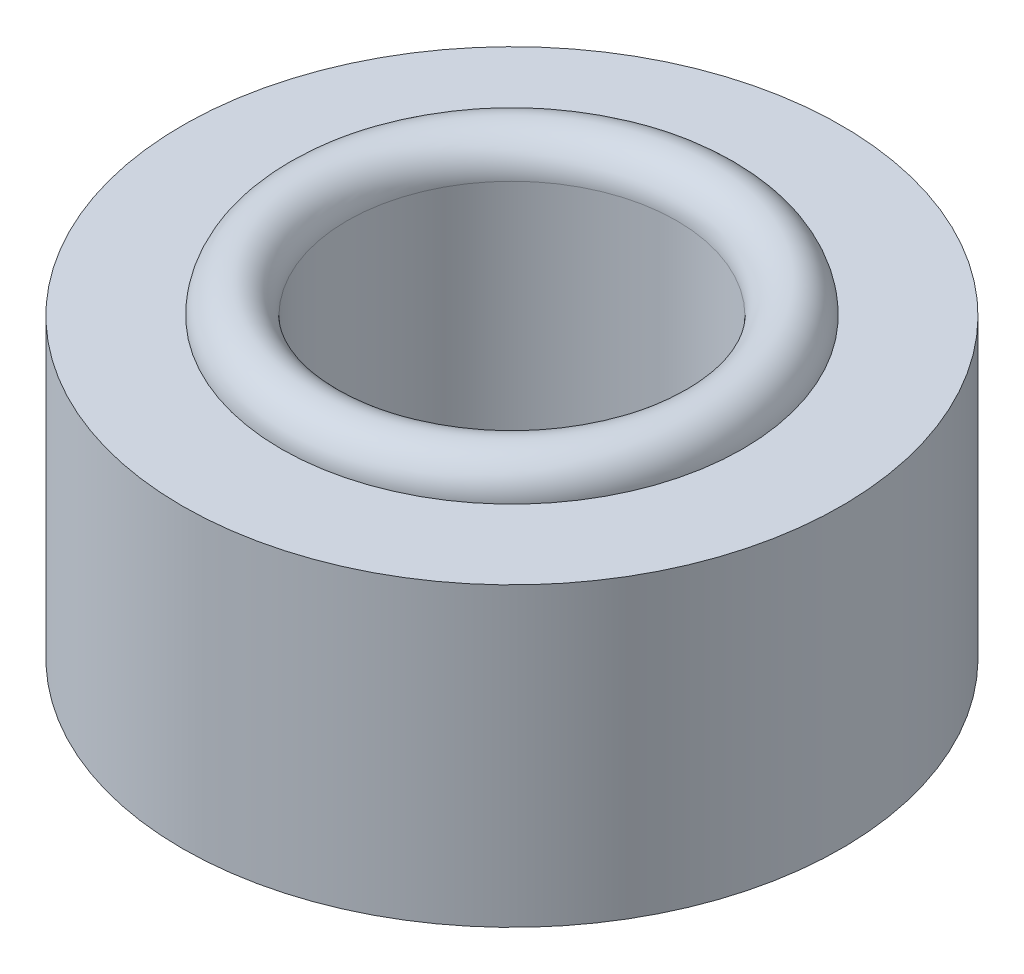
ISO-10303-21;
HEADER;
FILE_DESCRIPTION(('STEP AP214'),'2;1');
FILE_NAME('part.step','',(''),(''),'','','');
FILE_SCHEMA(('AUTOMOTIVE_DESIGN { 1 0 10303 214 1 1 1 1 }'));
ENDSEC;
DATA;
#1=APPLICATION_CONTEXT('core data for automotive mechanical design processes');
#2=APPLICATION_PROTOCOL_DEFINITION('international standard','automotive_design',2000,#1);
#3=PRODUCT_CONTEXT('',#1,'mechanical');
#4=PRODUCT('Part','Part','',(#3));
#5=PRODUCT_RELATED_PRODUCT_CATEGORY('part','',(#4));
#6=PRODUCT_DEFINITION_FORMATION('','',#4);
#7=PRODUCT_DEFINITION_CONTEXT('part definition',#1,'design');
#8=PRODUCT_DEFINITION('design','',#6,#7);
#9=PRODUCT_DEFINITION_SHAPE('','',#8);
#10=(LENGTH_UNIT() NAMED_UNIT(*) SI_UNIT(.MILLI.,.METRE.));
#11=(NAMED_UNIT(*) PLANE_ANGLE_UNIT() SI_UNIT($,.RADIAN.));
#12=(NAMED_UNIT(*) SI_UNIT($,.STERADIAN.) SOLID_ANGLE_UNIT());
#13=UNCERTAINTY_MEASURE_WITH_UNIT(LENGTH_MEASURE(1.E-05),#10,'distance_accuracy_value','');
#14=(GEOMETRIC_REPRESENTATION_CONTEXT(3) GLOBAL_UNCERTAINTY_ASSIGNED_CONTEXT((#13)) GLOBAL_UNIT_ASSIGNED_CONTEXT((#10,
#11,#12)) REPRESENTATION_CONTEXT('',''));
#15=CARTESIAN_POINT('',(0.,0.,0.));
#16=DIRECTION('',(0.,0.,1.));
#17=DIRECTION('',(1.,0.,0.));
#18=AXIS2_PLACEMENT_3D('',#15,#16,#17);
#19=CARTESIAN_POINT('',(0.,0.,0.));
#20=DIRECTION('',(0.,1.,0.));
#21=DIRECTION('',(0.,0.,1.));
#22=AXIS2_PLACEMENT_3D('',#19,#20,#21);
#23=TOROIDAL_SURFACE('',#22,6.,1.);
#24=CARTESIAN_POINT('',(0.,0.,0.));
#25=DIRECTION('',(0.,1.,0.));
#26=DIRECTION('',(0.,0.,1.));
#27=AXIS2_PLACEMENT_3D('',#24,#25,#26);
#28=CIRCLE('',#27,7.);
#29=CARTESIAN_POINT('',(0.,0.,7.));
#30=VERTEX_POINT('',#29);
#31=EDGE_CURVE('E57',#30,#30,#28,.T.);
#32=ORIENTED_EDGE('',*,*,#31,.F.);
#33=EDGE_LOOP('',(#32));
#34=FACE_BOUND('',#33,.T.);
#35=CARTESIAN_POINT('',(0.,0.,0.));
#36=DIRECTION('',(0.,1.,0.));
#37=DIRECTION('',(0.,0.,1.));
#38=AXIS2_PLACEMENT_3D('',#35,#36,#37);
#39=CIRCLE('',#38,5.);
#40=CARTESIAN_POINT('',(0.,0.,5.));
#41=VERTEX_POINT('',#40);
#42=EDGE_CURVE('E10',#41,#41,#39,.F.);
#43=ORIENTED_EDGE('',*,*,#42,.F.);
#44=EDGE_LOOP('',(#43));
#45=FACE_BOUND('',#44,.T.);
#46=ADVANCED_FACE('F34',(#34,#45),#23,.T.);
#47=CARTESIAN_POINT('',(0.,9.,0.));
#48=DIRECTION('',(0.,1.,0.));
#49=DIRECTION('',(0.,0.,1.));
#50=AXIS2_PLACEMENT_3D('',#47,#48,#49);
#51=TOROIDAL_SURFACE('',#50,6.,1.);
#52=CARTESIAN_POINT('',(0.,9.,0.));
#53=DIRECTION('',(0.,1.,0.));
#54=DIRECTION('',(0.,0.,1.));
#55=AXIS2_PLACEMENT_3D('',#52,#53,#54);
#56=CIRCLE('',#55,7.);
#57=CARTESIAN_POINT('',(0.,9.,7.));
#58=VERTEX_POINT('',#57);
#59=EDGE_CURVE('E53',#58,#58,#56,.T.);
#60=ORIENTED_EDGE('',*,*,#59,.T.);
#61=EDGE_LOOP('',(#60));
#62=FACE_BOUND('',#61,.T.);
#63=CARTESIAN_POINT('',(0.,9.,0.));
#64=DIRECTION('',(0.,1.,0.));
#65=DIRECTION('',(0.,0.,1.));
#66=AXIS2_PLACEMENT_3D('',#63,#64,#65);
#67=CIRCLE('',#66,5.);
#68=CARTESIAN_POINT('',(0.,9.,5.));
#69=VERTEX_POINT('',#68);
#70=EDGE_CURVE('E41',#69,#69,#67,.T.);
#71=ORIENTED_EDGE('',*,*,#70,.F.);
#72=EDGE_LOOP('',(#71));
#73=FACE_BOUND('',#72,.T.);
#74=ADVANCED_FACE('F66',(#62,#73),#51,.T.);
#75=CARTESIAN_POINT('',(0.,9.,0.));
#76=DIRECTION('',(0.,1.,0.));
#77=DIRECTION('',(0.,0.,1.));
#78=AXIS2_PLACEMENT_3D('',#75,#76,#77);
#79=PLANE('',#78);
#80=CARTESIAN_POINT('',(0.,9.,0.));
#81=DIRECTION('',(0.,1.,0.));
#82=DIRECTION('',(0.,0.,1.));
#83=AXIS2_PLACEMENT_3D('',#80,#81,#82);
#84=CIRCLE('',#83,10.);
#85=CARTESIAN_POINT('',(0.,9.,10.));
#86=VERTEX_POINT('',#85);
#87=EDGE_CURVE('E45',#86,#86,#84,.T.);
#88=ORIENTED_EDGE('',*,*,#87,.T.);
#89=EDGE_LOOP('',(#88));
#90=FACE_BOUND('',#89,.T.);
#91=ORIENTED_EDGE('',*,*,#59,.F.);
#92=EDGE_LOOP('',(#91));
#93=FACE_BOUND('',#92,.T.);
#94=ADVANCED_FACE('F70',(#90,#93),#79,.T.);
#95=CARTESIAN_POINT('',(0.,0.,0.));
#96=DIRECTION('',(0.,1.,0.));
#97=DIRECTION('',(0.,0.,1.));
#98=AXIS2_PLACEMENT_3D('',#95,#96,#97);
#99=PLANE('',#98);
#100=ORIENTED_EDGE('',*,*,#31,.T.);
#101=EDGE_LOOP('',(#100));
#102=FACE_BOUND('',#101,.T.);
#103=CARTESIAN_POINT('',(0.,0.,0.));
#104=DIRECTION('',(0.,1.,0.));
#105=DIRECTION('',(0.,0.,1.));
#106=AXIS2_PLACEMENT_3D('',#103,#104,#105);
#107=CIRCLE('',#106,10.);
#108=CARTESIAN_POINT('',(0.,0.,10.));
#109=VERTEX_POINT('',#108);
#110=EDGE_CURVE('E49',#109,#109,#107,.T.);
#111=ORIENTED_EDGE('',*,*,#110,.F.);
#112=EDGE_LOOP('',(#111));
#113=FACE_BOUND('',#112,.T.);
#114=ADVANCED_FACE('F61',(#102,#113),#99,.F.);
#115=CARTESIAN_POINT('',(0.,9.,0.));
#116=DIRECTION('',(0.,-1.,0.));
#117=DIRECTION('',(0.,0.,-1.));
#118=AXIS2_PLACEMENT_3D('',#115,#116,#117);
#119=CYLINDRICAL_SURFACE('',#118,10.);
#120=ORIENTED_EDGE('',*,*,#87,.F.);
#121=EDGE_LOOP('',(#120));
#122=FACE_BOUND('',#121,.T.);
#123=ORIENTED_EDGE('',*,*,#110,.T.);
#124=EDGE_LOOP('',(#123));
#125=FACE_BOUND('',#124,.T.);
#126=ADVANCED_FACE('F82',(#122,#125),#119,.T.);
#127=CARTESIAN_POINT('',(0.,9.,0.));
#128=DIRECTION('',(0.,-1.,0.));
#129=DIRECTION('',(0.,0.,-1.));
#130=AXIS2_PLACEMENT_3D('',#127,#128,#129);
#131=CYLINDRICAL_SURFACE('',#130,5.);
#132=ORIENTED_EDGE('',*,*,#42,.T.);
#133=EDGE_LOOP('',(#132));
#134=FACE_BOUND('',#133,.T.);
#135=ORIENTED_EDGE('',*,*,#70,.T.);
#136=EDGE_LOOP('',(#135));
#137=FACE_BOUND('',#136,.T.);
#138=ADVANCED_FACE('F85',(#134,#137),#131,.F.);
#139=CLOSED_SHELL('',(#46,#74,#94,#114,#126,#138));
#140=MANIFOLD_SOLID_BREP('B2',#139);
#141=ADVANCED_BREP_SHAPE_REPRESENTATION('',(#18,#140),#14);
#142=SHAPE_DEFINITION_REPRESENTATION(#9,#141);
ENDSEC;
END-ISO-10303-21;
